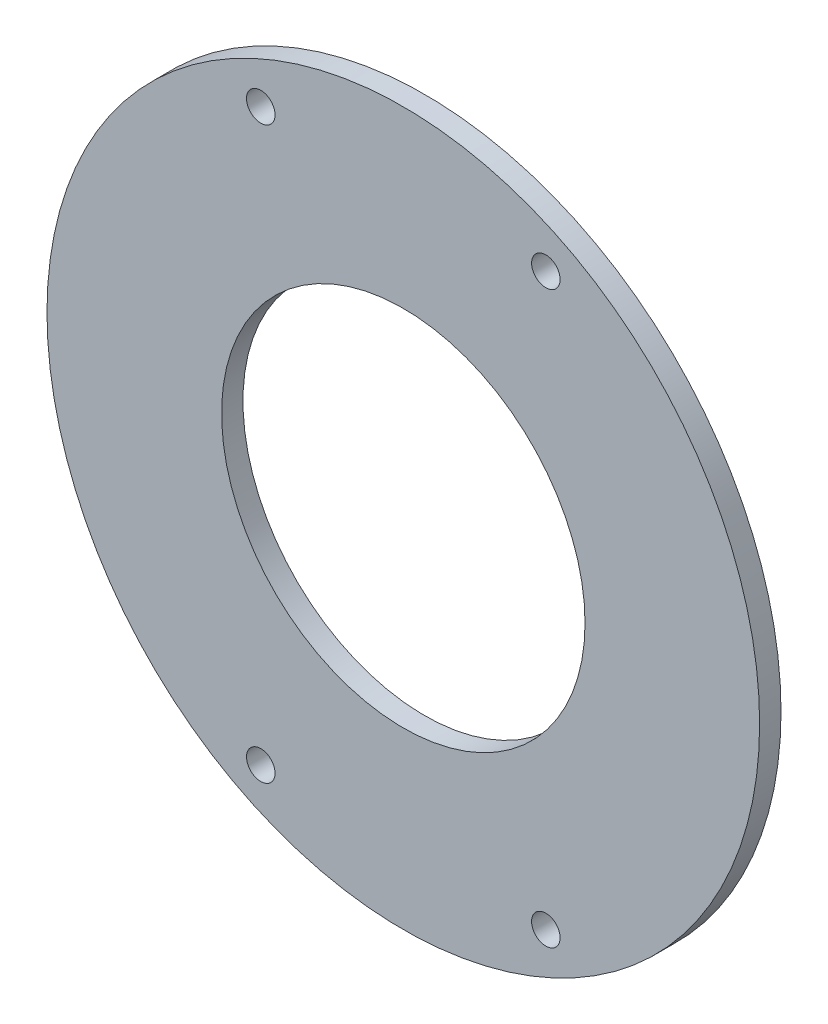
ISO-10303-21;
HEADER;
FILE_DESCRIPTION(('STEP AP214'),'2;1');
FILE_NAME('part.step','',(''),(''),'','','');
FILE_SCHEMA(('AUTOMOTIVE_DESIGN { 1 0 10303 214 1 1 1 1 }'));
ENDSEC;
DATA;
#1=APPLICATION_CONTEXT('core data for automotive mechanical design processes');
#2=APPLICATION_PROTOCOL_DEFINITION('international standard','automotive_design',2000,#1);
#3=PRODUCT_CONTEXT('',#1,'mechanical');
#4=PRODUCT('Part','Part','',(#3));
#5=PRODUCT_RELATED_PRODUCT_CATEGORY('part','',(#4));
#6=PRODUCT_DEFINITION_FORMATION('','',#4);
#7=PRODUCT_DEFINITION_CONTEXT('part definition',#1,'design');
#8=PRODUCT_DEFINITION('design','',#6,#7);
#9=PRODUCT_DEFINITION_SHAPE('','',#8);
#10=(LENGTH_UNIT() NAMED_UNIT(*) SI_UNIT(.MILLI.,.METRE.));
#11=(NAMED_UNIT(*) PLANE_ANGLE_UNIT() SI_UNIT($,.RADIAN.));
#12=(NAMED_UNIT(*) SI_UNIT($,.STERADIAN.) SOLID_ANGLE_UNIT());
#13=UNCERTAINTY_MEASURE_WITH_UNIT(LENGTH_MEASURE(1.E-05),#10,'distance_accuracy_value','');
#14=(GEOMETRIC_REPRESENTATION_CONTEXT(3) GLOBAL_UNCERTAINTY_ASSIGNED_CONTEXT((#13)) GLOBAL_UNIT_ASSIGNED_CONTEXT((#10,
#11,#12)) REPRESENTATION_CONTEXT('',''));
#15=CARTESIAN_POINT('',(0.,0.,0.));
#16=DIRECTION('',(0.,0.,1.));
#17=DIRECTION('',(1.,0.,0.));
#18=AXIS2_PLACEMENT_3D('',#15,#16,#17);
#19=CARTESIAN_POINT('',(0.,-21.8542857142857,3.));
#20=DIRECTION('',(0.,0.,1.));
#21=DIRECTION('',(1.,0.,0.));
#22=AXIS2_PLACEMENT_3D('',#19,#20,#21);
#23=PLANE('',#22);
#24=CARTESIAN_POINT('',(-19.9999999999999,-61.8542857142858,3.));
#25=DIRECTION('',(0.,0.,1.));
#26=DIRECTION('',(-1.,0.,0.));
#27=AXIS2_PLACEMENT_3D('',#24,#25,#26);
#28=CIRCLE('',#27,1.99999999999998);
#29=CARTESIAN_POINT('',(-21.9999999999999,-61.8542857142858,3.));
#30=VERTEX_POINT('',#29);
#31=EDGE_CURVE('E72',#30,#30,#28,.T.);
#32=ORIENTED_EDGE('',*,*,#31,.F.);
#33=EDGE_LOOP('',(#32));
#34=FACE_BOUND('',#33,.T.);
#35=CARTESIAN_POINT('',(20.,18.1457142857143,3.));
#36=DIRECTION('',(0.,0.,1.));
#37=DIRECTION('',(1.,0.,0.));
#38=AXIS2_PLACEMENT_3D('',#35,#36,#37);
#39=CIRCLE('',#38,2.);
#40=CARTESIAN_POINT('',(22.,18.1457142857143,3.));
#41=VERTEX_POINT('',#40);
#42=EDGE_CURVE('E56',#41,#41,#39,.T.);
#43=ORIENTED_EDGE('',*,*,#42,.F.);
#44=EDGE_LOOP('',(#43));
#45=FACE_BOUND('',#44,.T.);
#46=CARTESIAN_POINT('',(0.,-21.8542857142857,3.));
#47=DIRECTION('',(0.,0.,1.));
#48=DIRECTION('',(1.,0.,0.));
#49=AXIS2_PLACEMENT_3D('',#46,#47,#48);
#50=CIRCLE('',#49,50.);
#51=CARTESIAN_POINT('',(50.,-21.8542857142857,3.));
#52=VERTEX_POINT('',#51);
#53=EDGE_CURVE('E10',#52,#52,#50,.T.);
#54=ORIENTED_EDGE('',*,*,#53,.T.);
#55=EDGE_LOOP('',(#54));
#56=FACE_BOUND('',#55,.T.);
#57=CARTESIAN_POINT('',(-19.9999999999999,18.1457142857144,3.));
#58=DIRECTION('',(0.,0.,1.));
#59=DIRECTION('',(1.,0.,0.));
#60=AXIS2_PLACEMENT_3D('',#57,#58,#59);
#61=CIRCLE('',#60,1.99999999999998);
#62=CARTESIAN_POINT('',(-17.9999999999999,18.1457142857144,3.));
#63=VERTEX_POINT('',#62);
#64=EDGE_CURVE('E50',#63,#63,#61,.T.);
#65=ORIENTED_EDGE('',*,*,#64,.F.);
#66=EDGE_LOOP('',(#65));
#67=FACE_BOUND('',#66,.T.);
#68=CARTESIAN_POINT('',(20.,-61.8542857142857,3.));
#69=DIRECTION('',(0.,0.,1.));
#70=DIRECTION('',(-1.,0.,0.));
#71=AXIS2_PLACEMENT_3D('',#68,#69,#70);
#72=CIRCLE('',#71,2.);
#73=CARTESIAN_POINT('',(18.,-61.8542857142857,3.));
#74=VERTEX_POINT('',#73);
#75=EDGE_CURVE('E64',#74,#74,#72,.T.);
#76=ORIENTED_EDGE('',*,*,#75,.F.);
#77=EDGE_LOOP('',(#76));
#78=FACE_BOUND('',#77,.T.);
#79=CARTESIAN_POINT('',(0.,-21.8542857142857,3.));
#80=DIRECTION('',(0.,0.,1.));
#81=DIRECTION('',(1.,0.,0.));
#82=AXIS2_PLACEMENT_3D('',#79,#80,#81);
#83=CIRCLE('',#82,25.5);
#84=CARTESIAN_POINT('',(25.5,-21.8542857142857,3.));
#85=VERTEX_POINT('',#84);
#86=EDGE_CURVE('E80',#85,#85,#83,.T.);
#87=ORIENTED_EDGE('',*,*,#86,.F.);
#88=EDGE_LOOP('',(#87));
#89=FACE_BOUND('',#88,.T.);
#90=ADVANCED_FACE('F37',(#34,#45,#56,#67,#78,#89),#23,.T.);
#91=CARTESIAN_POINT('',(0.,-21.8542857142857,0.));
#92=DIRECTION('',(0.,0.,1.));
#93=DIRECTION('',(1.,0.,0.));
#94=AXIS2_PLACEMENT_3D('',#91,#92,#93);
#95=PLANE('',#94);
#96=CARTESIAN_POINT('',(0.,-21.8542857142857,0.));
#97=DIRECTION('',(0.,0.,1.));
#98=DIRECTION('',(1.,0.,0.));
#99=AXIS2_PLACEMENT_3D('',#96,#97,#98);
#100=CIRCLE('',#99,50.);
#101=CARTESIAN_POINT('',(50.,-21.8542857142857,0.));
#102=VERTEX_POINT('',#101);
#103=EDGE_CURVE('E41',#102,#102,#100,.T.);
#104=ORIENTED_EDGE('',*,*,#103,.F.);
#105=EDGE_LOOP('',(#104));
#106=FACE_BOUND('',#105,.T.);
#107=CARTESIAN_POINT('',(-19.9999999999999,18.1457142857144,0.));
#108=DIRECTION('',(0.,0.,1.));
#109=DIRECTION('',(1.,0.,0.));
#110=AXIS2_PLACEMENT_3D('',#107,#108,#109);
#111=CIRCLE('',#110,1.99999999999998);
#112=CARTESIAN_POINT('',(-17.9999999999999,18.1457142857144,0.));
#113=VERTEX_POINT('',#112);
#114=EDGE_CURVE('E52',#113,#113,#111,.T.);
#115=ORIENTED_EDGE('',*,*,#114,.T.);
#116=EDGE_LOOP('',(#115));
#117=FACE_BOUND('',#116,.T.);
#118=CARTESIAN_POINT('',(20.,18.1457142857143,0.));
#119=DIRECTION('',(0.,0.,1.));
#120=DIRECTION('',(1.,0.,0.));
#121=AXIS2_PLACEMENT_3D('',#118,#119,#120);
#122=CIRCLE('',#121,2.);
#123=CARTESIAN_POINT('',(22.,18.1457142857143,0.));
#124=VERTEX_POINT('',#123);
#125=EDGE_CURVE('E60',#124,#124,#122,.T.);
#126=ORIENTED_EDGE('',*,*,#125,.T.);
#127=EDGE_LOOP('',(#126));
#128=FACE_BOUND('',#127,.T.);
#129=CARTESIAN_POINT('',(20.,-61.8542857142857,0.));
#130=DIRECTION('',(0.,0.,1.));
#131=DIRECTION('',(-1.,0.,0.));
#132=AXIS2_PLACEMENT_3D('',#129,#130,#131);
#133=CIRCLE('',#132,2.);
#134=CARTESIAN_POINT('',(18.,-61.8542857142857,0.));
#135=VERTEX_POINT('',#134);
#136=EDGE_CURVE('E68',#135,#135,#133,.T.);
#137=ORIENTED_EDGE('',*,*,#136,.T.);
#138=EDGE_LOOP('',(#137));
#139=FACE_BOUND('',#138,.T.);
#140=CARTESIAN_POINT('',(-19.9999999999999,-61.8542857142858,0.));
#141=DIRECTION('',(0.,0.,1.));
#142=DIRECTION('',(-1.,0.,0.));
#143=AXIS2_PLACEMENT_3D('',#140,#141,#142);
#144=CIRCLE('',#143,1.99999999999998);
#145=CARTESIAN_POINT('',(-21.9999999999999,-61.8542857142858,0.));
#146=VERTEX_POINT('',#145);
#147=EDGE_CURVE('E76',#146,#146,#144,.T.);
#148=ORIENTED_EDGE('',*,*,#147,.T.);
#149=EDGE_LOOP('',(#148));
#150=FACE_BOUND('',#149,.T.);
#151=CARTESIAN_POINT('',(0.,-21.8542857142857,0.));
#152=DIRECTION('',(0.,0.,1.));
#153=DIRECTION('',(1.,0.,0.));
#154=AXIS2_PLACEMENT_3D('',#151,#152,#153);
#155=CIRCLE('',#154,25.5);
#156=CARTESIAN_POINT('',(25.5,-21.8542857142857,0.));
#157=VERTEX_POINT('',#156);
#158=EDGE_CURVE('E84',#157,#157,#155,.T.);
#159=ORIENTED_EDGE('',*,*,#158,.T.);
#160=EDGE_LOOP('',(#159));
#161=FACE_BOUND('',#160,.T.);
#162=ADVANCED_FACE('F96',(#106,#117,#128,#139,#150,#161),#95,.F.);
#163=CARTESIAN_POINT('',(0.,-21.8542857142857,3.));
#164=DIRECTION('',(0.,0.,-1.));
#165=DIRECTION('',(-1.,0.,0.));
#166=AXIS2_PLACEMENT_3D('',#163,#164,#165);
#167=CYLINDRICAL_SURFACE('',#166,50.);
#168=ORIENTED_EDGE('',*,*,#53,.F.);
#169=EDGE_LOOP('',(#168));
#170=FACE_BOUND('',#169,.T.);
#171=ORIENTED_EDGE('',*,*,#103,.T.);
#172=EDGE_LOOP('',(#171));
#173=FACE_BOUND('',#172,.T.);
#174=ADVANCED_FACE('F39',(#170,#173),#167,.T.);
#175=CARTESIAN_POINT('',(-19.9999999999999,18.1457142857144,3.));
#176=DIRECTION('',(0.,0.,-1.));
#177=DIRECTION('',(-1.,0.,0.));
#178=AXIS2_PLACEMENT_3D('',#175,#176,#177);
#179=CYLINDRICAL_SURFACE('',#178,1.99999999999998);
#180=ORIENTED_EDGE('',*,*,#64,.T.);
#181=EDGE_LOOP('',(#180));
#182=FACE_BOUND('',#181,.T.);
#183=ORIENTED_EDGE('',*,*,#114,.F.);
#184=EDGE_LOOP('',(#183));
#185=FACE_BOUND('',#184,.T.);
#186=ADVANCED_FACE('F106',(#182,#185),#179,.F.);
#187=CARTESIAN_POINT('',(20.,18.1457142857143,3.));
#188=DIRECTION('',(0.,0.,-1.));
#189=DIRECTION('',(-1.,0.,0.));
#190=AXIS2_PLACEMENT_3D('',#187,#188,#189);
#191=CYLINDRICAL_SURFACE('',#190,2.);
#192=ORIENTED_EDGE('',*,*,#42,.T.);
#193=EDGE_LOOP('',(#192));
#194=FACE_BOUND('',#193,.T.);
#195=ORIENTED_EDGE('',*,*,#125,.F.);
#196=EDGE_LOOP('',(#195));
#197=FACE_BOUND('',#196,.T.);
#198=ADVANCED_FACE('F109',(#194,#197),#191,.F.);
#199=CARTESIAN_POINT('',(20.,-61.8542857142857,3.));
#200=DIRECTION('',(0.,0.,-1.));
#201=DIRECTION('',(-1.,0.,0.));
#202=AXIS2_PLACEMENT_3D('',#199,#200,#201);
#203=CYLINDRICAL_SURFACE('',#202,2.);
#204=ORIENTED_EDGE('',*,*,#75,.T.);
#205=EDGE_LOOP('',(#204));
#206=FACE_BOUND('',#205,.T.);
#207=ORIENTED_EDGE('',*,*,#136,.F.);
#208=EDGE_LOOP('',(#207));
#209=FACE_BOUND('',#208,.T.);
#210=ADVANCED_FACE('F113',(#206,#209),#203,.F.);
#211=CARTESIAN_POINT('',(-19.9999999999999,-61.8542857142858,3.));
#212=DIRECTION('',(0.,0.,-1.));
#213=DIRECTION('',(-1.,0.,0.));
#214=AXIS2_PLACEMENT_3D('',#211,#212,#213);
#215=CYLINDRICAL_SURFACE('',#214,1.99999999999998);
#216=ORIENTED_EDGE('',*,*,#31,.T.);
#217=EDGE_LOOP('',(#216));
#218=FACE_BOUND('',#217,.T.);
#219=ORIENTED_EDGE('',*,*,#147,.F.);
#220=EDGE_LOOP('',(#219));
#221=FACE_BOUND('',#220,.T.);
#222=ADVANCED_FACE('F117',(#218,#221),#215,.F.);
#223=CARTESIAN_POINT('',(0.,-21.8542857142857,3.));
#224=DIRECTION('',(0.,0.,-1.));
#225=DIRECTION('',(-1.,0.,0.));
#226=AXIS2_PLACEMENT_3D('',#223,#224,#225);
#227=CYLINDRICAL_SURFACE('',#226,25.5);
#228=ORIENTED_EDGE('',*,*,#86,.T.);
#229=EDGE_LOOP('',(#228));
#230=FACE_BOUND('',#229,.T.);
#231=ORIENTED_EDGE('',*,*,#158,.F.);
#232=EDGE_LOOP('',(#231));
#233=FACE_BOUND('',#232,.T.);
#234=ADVANCED_FACE('F92',(#230,#233),#227,.F.);
#235=CLOSED_SHELL('',(#90,#162,#174,#186,#198,#210,#222,#234));
#236=MANIFOLD_SOLID_BREP('B2',#235);
#237=ADVANCED_BREP_SHAPE_REPRESENTATION('',(#18,#236),#14);
#238=SHAPE_DEFINITION_REPRESENTATION(#9,#237);
ENDSEC;
END-ISO-10303-21;
